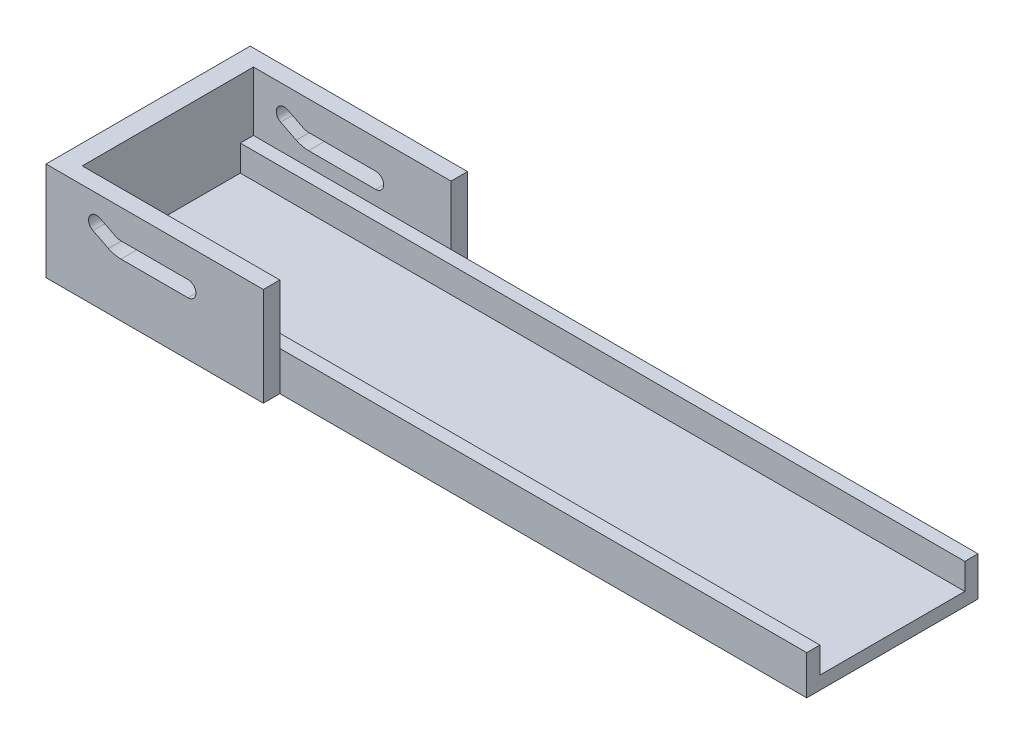
ISO-10303-21;
HEADER;
FILE_DESCRIPTION(('STEP AP214'),'2;1');
FILE_NAME('part.step','',(''),(''),'','','');
FILE_SCHEMA(('AUTOMOTIVE_DESIGN { 1 0 10303 214 1 1 1 1 }'));
ENDSEC;
DATA;
#1=APPLICATION_CONTEXT('core data for automotive mechanical design processes');
#2=APPLICATION_PROTOCOL_DEFINITION('international standard','automotive_design',2000,#1);
#3=PRODUCT_CONTEXT('',#1,'mechanical');
#4=PRODUCT('Part','Part','',(#3));
#5=PRODUCT_RELATED_PRODUCT_CATEGORY('part','',(#4));
#6=PRODUCT_DEFINITION_FORMATION('','',#4);
#7=PRODUCT_DEFINITION_CONTEXT('part definition',#1,'design');
#8=PRODUCT_DEFINITION('design','',#6,#7);
#9=PRODUCT_DEFINITION_SHAPE('','',#8);
#10=(LENGTH_UNIT() NAMED_UNIT(*) SI_UNIT(.MILLI.,.METRE.));
#11=(NAMED_UNIT(*) PLANE_ANGLE_UNIT() SI_UNIT($,.RADIAN.));
#12=(NAMED_UNIT(*) SI_UNIT($,.STERADIAN.) SOLID_ANGLE_UNIT());
#13=UNCERTAINTY_MEASURE_WITH_UNIT(LENGTH_MEASURE(1.E-05),#10,'distance_accuracy_value','');
#14=(GEOMETRIC_REPRESENTATION_CONTEXT(3) GLOBAL_UNCERTAINTY_ASSIGNED_CONTEXT((#13)) GLOBAL_UNIT_ASSIGNED_CONTEXT((#10,
#11,#12)) REPRESENTATION_CONTEXT('',''));
#15=CARTESIAN_POINT('',(0.,0.,0.));
#16=DIRECTION('',(0.,0.,1.));
#17=DIRECTION('',(1.,0.,0.));
#18=AXIS2_PLACEMENT_3D('',#15,#16,#17);
#19=CARTESIAN_POINT('',(110.,0.,0.));
#20=DIRECTION('',(-1.,0.,0.));
#21=DIRECTION('',(0.,0.,1.));
#22=AXIS2_PLACEMENT_3D('',#19,#20,#21);
#23=PLANE('',#22);
#24=DIRECTION('',(0.,1.,0.));
#25=VECTOR('',#24,1.);
#26=CARTESIAN_POINT('',(110.,5.95,-13.));
#27=LINE('',#26,#25);
#28=CARTESIAN_POINT('',(110.,-5.95,-13.));
#29=VERTEX_POINT('',#28);
#30=CARTESIAN_POINT('',(110.,0.,-13.));
#31=VERTEX_POINT('',#30);
#32=EDGE_CURVE('E550',#29,#31,#27,.T.);
#33=ORIENTED_EDGE('',*,*,#32,.T.);
#34=DIRECTION('',(0.,0.,1.));
#35=VECTOR('',#34,1.);
#36=CARTESIAN_POINT('',(110.,0.,0.));
#37=LINE('',#36,#35);
#38=CARTESIAN_POINT('',(110.,0.,-11.));
#39=VERTEX_POINT('',#38);
#40=EDGE_CURVE('E507',#31,#39,#37,.T.);
#41=ORIENTED_EDGE('',*,*,#40,.T.);
#42=DIRECTION('',(0.,1.,0.));
#43=VECTOR('',#42,1.);
#44=CARTESIAN_POINT('',(110.,3.95,-11.));
#45=LINE('',#44,#43);
#46=CARTESIAN_POINT('',(110.,-3.95,-11.));
#47=VERTEX_POINT('',#46);
#48=EDGE_CURVE('E516',#47,#39,#45,.T.);
#49=ORIENTED_EDGE('',*,*,#48,.F.);
#50=DIRECTION('',(0.,0.,-1.));
#51=VECTOR('',#50,1.);
#52=CARTESIAN_POINT('',(110.,-3.95,11.));
#53=LINE('',#52,#51);
#54=CARTESIAN_POINT('',(110.,-3.95,11.));
#55=VERTEX_POINT('',#54);
#56=EDGE_CURVE('E524',#55,#47,#53,.T.);
#57=ORIENTED_EDGE('',*,*,#56,.F.);
#58=DIRECTION('',(0.,-1.,0.));
#59=VECTOR('',#58,1.);
#60=CARTESIAN_POINT('',(110.,3.95,11.));
#61=LINE('',#60,#59);
#62=CARTESIAN_POINT('',(110.,0.,11.));
#63=VERTEX_POINT('',#62);
#64=EDGE_CURVE('E520',#63,#55,#61,.T.);
#65=ORIENTED_EDGE('',*,*,#64,.F.);
#66=CARTESIAN_POINT('',(110.,0.,13.));
#67=VERTEX_POINT('',#66);
#68=EDGE_CURVE('E501',#63,#67,#37,.T.);
#69=ORIENTED_EDGE('',*,*,#68,.T.);
#70=DIRECTION('',(0.,-1.,0.));
#71=VECTOR('',#70,1.);
#72=CARTESIAN_POINT('',(110.,5.95,13.));
#73=LINE('',#72,#71);
#74=CARTESIAN_POINT('',(110.,-5.95,13.));
#75=VERTEX_POINT('',#74);
#76=EDGE_CURVE('E544',#67,#75,#73,.T.);
#77=ORIENTED_EDGE('',*,*,#76,.T.);
#78=DIRECTION('',(0.,0.,-1.));
#79=VECTOR('',#78,1.);
#80=CARTESIAN_POINT('',(110.,-5.95,13.));
#81=LINE('',#80,#79);
#82=EDGE_CURVE('E547',#75,#29,#81,.T.);
#83=ORIENTED_EDGE('',*,*,#82,.T.);
#84=EDGE_LOOP('',(#33,#41,#49,#57,#65,#69,#77,#83));
#85=FACE_BOUND('',#84,.T.);
#86=ADVANCED_FACE('F45',(#85),#23,.F.);
#87=CARTESIAN_POINT('',(110.,5.95,13.));
#88=DIRECTION('',(0.,0.,-1.));
#89=DIRECTION('',(0.,1.,0.));
#90=AXIS2_PLACEMENT_3D('',#87,#88,#89);
#91=PLANE('',#90);
#92=DIRECTION('',(1.,0.,0.));
#93=VECTOR('',#92,1.);
#94=CARTESIAN_POINT('',(-3.21348539826178,0.,13.));
#95=LINE('',#94,#93);
#96=CARTESIAN_POINT('',(30.,0.,13.));
#97=VERTEX_POINT('',#96);
#98=EDGE_CURVE('E487',#97,#67,#95,.T.);
#99=ORIENTED_EDGE('',*,*,#98,.F.);
#100=DIRECTION('',(0.,-1.,0.));
#101=VECTOR('',#100,1.);
#102=CARTESIAN_POINT('',(30.,-5.95,13.));
#103=LINE('',#102,#101);
#104=CARTESIAN_POINT('',(30.,-5.95,13.));
#105=VERTEX_POINT('',#104);
#106=EDGE_CURVE('E11',#97,#105,#103,.T.);
#107=ORIENTED_EDGE('',*,*,#106,.T.);
#108=DIRECTION('',(-1.,0.,0.));
#109=VECTOR('',#108,1.);
#110=CARTESIAN_POINT('',(110.,-5.95,13.));
#111=LINE('',#110,#109);
#112=EDGE_CURVE('E557',#75,#105,#111,.T.);
#113=ORIENTED_EDGE('',*,*,#112,.F.);
#114=ORIENTED_EDGE('',*,*,#76,.F.);
#115=EDGE_LOOP('',(#99,#107,#113,#114));
#116=FACE_BOUND('',#115,.T.);
#117=ADVANCED_FACE('F47',(#116),#91,.F.);
#118=CARTESIAN_POINT('',(110.,-5.95,13.));
#119=DIRECTION('',(0.,1.,0.));
#120=DIRECTION('',(0.,0.,1.));
#121=AXIS2_PLACEMENT_3D('',#118,#119,#120);
#122=PLANE('',#121);
#123=DIRECTION('',(-1.,0.,0.));
#124=VECTOR('',#123,1.);
#125=CARTESIAN_POINT('',(30.,-5.95,15.5));
#126=LINE('',#125,#124);
#127=CARTESIAN_POINT('',(30.,-5.95,15.5));
#128=VERTEX_POINT('',#127);
#129=CARTESIAN_POINT('',(-3.,-5.95,15.5));
#130=VERTEX_POINT('',#129);
#131=EDGE_CURVE('E436',#128,#130,#126,.T.);
#132=ORIENTED_EDGE('',*,*,#131,.T.);
#133=DIRECTION('',(0.,0.,1.));
#134=VECTOR('',#133,1.);
#135=CARTESIAN_POINT('',(-3.,-5.95,-15.5));
#136=LINE('',#135,#134);
#137=CARTESIAN_POINT('',(-3.,-5.95,-15.5));
#138=VERTEX_POINT('',#137);
#139=EDGE_CURVE('E420',#138,#130,#136,.T.);
#140=ORIENTED_EDGE('',*,*,#139,.F.);
#141=DIRECTION('',(-1.,0.,0.));
#142=VECTOR('',#141,1.);
#143=CARTESIAN_POINT('',(30.,-5.95,-15.5));
#144=LINE('',#143,#142);
#145=CARTESIAN_POINT('',(30.,-5.95,-15.5));
#146=VERTEX_POINT('',#145);
#147=EDGE_CURVE('E484',#146,#138,#144,.T.);
#148=ORIENTED_EDGE('',*,*,#147,.F.);
#149=DIRECTION('',(0.,0.,1.));
#150=VECTOR('',#149,1.);
#151=CARTESIAN_POINT('',(30.,-5.95,-13.));
#152=LINE('',#151,#150);
#153=CARTESIAN_POINT('',(30.,-5.95,-13.));
#154=VERTEX_POINT('',#153);
#155=EDGE_CURVE('E476',#146,#154,#152,.T.);
#156=ORIENTED_EDGE('',*,*,#155,.T.);
#157=DIRECTION('',(-1.,0.,0.));
#158=VECTOR('',#157,1.);
#159=CARTESIAN_POINT('',(110.,-5.95,-13.));
#160=LINE('',#159,#158);
#161=EDGE_CURVE('E554',#29,#154,#160,.T.);
#162=ORIENTED_EDGE('',*,*,#161,.F.);
#163=ORIENTED_EDGE('',*,*,#82,.F.);
#164=ORIENTED_EDGE('',*,*,#112,.T.);
#165=DIRECTION('',(0.,0.,1.));
#166=VECTOR('',#165,1.);
#167=CARTESIAN_POINT('',(30.,-5.95,13.));
#168=LINE('',#167,#166);
#169=EDGE_CURVE('E457',#105,#128,#168,.T.);
#170=ORIENTED_EDGE('',*,*,#169,.T.);
#171=EDGE_LOOP('',(#132,#140,#148,#156,#162,#163,#164,#170));
#172=FACE_BOUND('',#171,.T.);
#173=ADVANCED_FACE('F589',(#172),#122,.F.);
#174=CARTESIAN_POINT('',(110.,5.95,-13.));
#175=DIRECTION('',(0.,0.,1.));
#176=DIRECTION('',(0.,-1.,0.));
#177=AXIS2_PLACEMENT_3D('',#174,#175,#176);
#178=PLANE('',#177);
#179=ORIENTED_EDGE('',*,*,#161,.T.);
#180=DIRECTION('',(0.,1.,0.));
#181=VECTOR('',#180,1.);
#182=CARTESIAN_POINT('',(30.,-5.95,-13.));
#183=LINE('',#182,#181);
#184=CARTESIAN_POINT('',(30.,0.,-13.));
#185=VERTEX_POINT('',#184);
#186=EDGE_CURVE('E463',#154,#185,#183,.T.);
#187=ORIENTED_EDGE('',*,*,#186,.T.);
#188=DIRECTION('',(1.,0.,0.));
#189=VECTOR('',#188,1.);
#190=CARTESIAN_POINT('',(110.,0.,-13.));
#191=LINE('',#190,#189);
#192=EDGE_CURVE('E515',#185,#31,#191,.T.);
#193=ORIENTED_EDGE('',*,*,#192,.T.);
#194=ORIENTED_EDGE('',*,*,#32,.F.);
#195=EDGE_LOOP('',(#179,#187,#193,#194));
#196=FACE_BOUND('',#195,.T.);
#197=ADVANCED_FACE('F595',(#196),#178,.F.);
#198=CARTESIAN_POINT('',(110.,3.95,-11.));
#199=DIRECTION('',(0.,0.,1.));
#200=DIRECTION('',(0.,-1.,0.));
#201=AXIS2_PLACEMENT_3D('',#198,#199,#200);
#202=PLANE('',#201);
#203=DIRECTION('',(1.,0.,0.));
#204=VECTOR('',#203,1.);
#205=CARTESIAN_POINT('',(110.,0.,-11.));
#206=LINE('',#205,#204);
#207=CARTESIAN_POINT('',(0.,0.,-11.));
#208=VERTEX_POINT('',#207);
#209=EDGE_CURVE('E506',#208,#39,#206,.T.);
#210=ORIENTED_EDGE('',*,*,#209,.F.);
#211=DIRECTION('',(0.,1.,0.));
#212=VECTOR('',#211,1.);
#213=CARTESIAN_POINT('',(0.,3.95,-11.));
#214=LINE('',#213,#212);
#215=CARTESIAN_POINT('',(0.,-3.95,-11.));
#216=VERTEX_POINT('',#215);
#217=EDGE_CURVE('E514',#216,#208,#214,.T.);
#218=ORIENTED_EDGE('',*,*,#217,.F.);
#219=DIRECTION('',(-1.,0.,0.));
#220=VECTOR('',#219,1.);
#221=CARTESIAN_POINT('',(110.,-3.95,-11.));
#222=LINE('',#221,#220);
#223=EDGE_CURVE('E527',#47,#216,#222,.T.);
#224=ORIENTED_EDGE('',*,*,#223,.F.);
#225=ORIENTED_EDGE('',*,*,#48,.T.);
#226=EDGE_LOOP('',(#210,#218,#224,#225));
#227=FACE_BOUND('',#226,.T.);
#228=ADVANCED_FACE('F606',(#227),#202,.T.);
#229=CARTESIAN_POINT('',(110.,3.95,11.));
#230=DIRECTION('',(0.,0.,-1.));
#231=DIRECTION('',(0.,1.,0.));
#232=AXIS2_PLACEMENT_3D('',#229,#230,#231);
#233=PLANE('',#232);
#234=DIRECTION('',(-1.,0.,0.));
#235=VECTOR('',#234,1.);
#236=CARTESIAN_POINT('',(110.,0.,11.));
#237=LINE('',#236,#235);
#238=CARTESIAN_POINT('',(0.,0.,11.));
#239=VERTEX_POINT('',#238);
#240=EDGE_CURVE('E49',#63,#239,#237,.T.);
#241=ORIENTED_EDGE('',*,*,#240,.F.);
#242=ORIENTED_EDGE('',*,*,#64,.T.);
#243=DIRECTION('',(-1.,0.,0.));
#244=VECTOR('',#243,1.);
#245=CARTESIAN_POINT('',(110.,-3.95,11.));
#246=LINE('',#245,#244);
#247=CARTESIAN_POINT('',(0.,-3.95,11.));
#248=VERTEX_POINT('',#247);
#249=EDGE_CURVE('E541',#55,#248,#246,.T.);
#250=ORIENTED_EDGE('',*,*,#249,.T.);
#251=DIRECTION('',(0.,-1.,0.));
#252=VECTOR('',#251,1.);
#253=CARTESIAN_POINT('',(0.,3.95,11.));
#254=LINE('',#253,#252);
#255=EDGE_CURVE('E531',#239,#248,#254,.T.);
#256=ORIENTED_EDGE('',*,*,#255,.F.);
#257=EDGE_LOOP('',(#241,#242,#250,#256));
#258=FACE_BOUND('',#257,.T.);
#259=ADVANCED_FACE('F571',(#258),#233,.T.);
#260=CARTESIAN_POINT('',(110.,-3.95,11.));
#261=DIRECTION('',(0.,1.,0.));
#262=DIRECTION('',(0.,0.,1.));
#263=AXIS2_PLACEMENT_3D('',#260,#261,#262);
#264=PLANE('',#263);
#265=DIRECTION('',(0.,0.,-1.));
#266=VECTOR('',#265,1.);
#267=CARTESIAN_POINT('',(0.,-3.95,11.));
#268=LINE('',#267,#266);
#269=EDGE_CURVE('E521',#248,#216,#268,.T.);
#270=ORIENTED_EDGE('',*,*,#269,.F.);
#271=ORIENTED_EDGE('',*,*,#249,.F.);
#272=ORIENTED_EDGE('',*,*,#56,.T.);
#273=ORIENTED_EDGE('',*,*,#223,.T.);
#274=EDGE_LOOP('',(#270,#271,#272,#273));
#275=FACE_BOUND('',#274,.T.);
#276=ADVANCED_FACE('F608',(#275),#264,.T.);
#277=CARTESIAN_POINT('',(-3.21348539826178,0.,-37.));
#278=DIRECTION('',(0.,-1.,0.));
#279=DIRECTION('',(0.,0.,-1.));
#280=AXIS2_PLACEMENT_3D('',#277,#278,#279);
#281=PLANE('',#280);
#282=ORIENTED_EDGE('',*,*,#240,.T.);
#283=DIRECTION('',(0.,0.,1.));
#284=VECTOR('',#283,1.);
#285=CARTESIAN_POINT('',(0.,0.,0.));
#286=LINE('',#285,#284);
#287=CARTESIAN_POINT('',(0.,0.,13.));
#288=VERTEX_POINT('',#287);
#289=EDGE_CURVE('E497',#239,#288,#286,.T.);
#290=ORIENTED_EDGE('',*,*,#289,.T.);
#291=EDGE_CURVE('E493',#288,#97,#95,.T.);
#292=ORIENTED_EDGE('',*,*,#291,.T.);
#293=ORIENTED_EDGE('',*,*,#98,.T.);
#294=ORIENTED_EDGE('',*,*,#68,.F.);
#295=EDGE_LOOP('',(#282,#290,#292,#293,#294));
#296=FACE_BOUND('',#295,.T.);
#297=ADVANCED_FACE('F567',(#296),#281,.F.);
#298=CARTESIAN_POINT('',(0.,0.,-13.));
#299=VERTEX_POINT('',#298);
#300=EDGE_CURVE('E502',#299,#208,#286,.T.);
#301=ORIENTED_EDGE('',*,*,#300,.T.);
#302=ORIENTED_EDGE('',*,*,#209,.T.);
#303=ORIENTED_EDGE('',*,*,#40,.F.);
#304=ORIENTED_EDGE('',*,*,#192,.F.);
#305=EDGE_CURVE('E510',#299,#185,#191,.T.);
#306=ORIENTED_EDGE('',*,*,#305,.F.);
#307=EDGE_LOOP('',(#301,#302,#303,#304,#306));
#308=FACE_BOUND('',#307,.T.);
#309=ADVANCED_FACE('F601',(#308),#281,.F.);
#310=CARTESIAN_POINT('',(30.,-5.95,-13.));
#311=DIRECTION('',(0.,0.,1.));
#312=DIRECTION('',(1.,0.,0.));
#313=AXIS2_PLACEMENT_3D('',#310,#311,#312);
#314=PLANE('',#313);
#315=CARTESIAN_POINT('',(8.37948162930157,6.41681227616429,-13.));
#316=DIRECTION('',(0.,0.,1.));
#317=DIRECTION('',(1.,0.,0.));
#318=AXIS2_PLACEMENT_3D('',#315,#316,#317);
#319=CIRCLE('',#318,4.22953266978898);
#320=CARTESIAN_POINT('',(8.37948162930157,2.18727960637531,-13.));
#321=VERTEX_POINT('',#320);
#322=CARTESIAN_POINT('',(6.4879771167607,2.63380325108256,-13.));
#323=VERTEX_POINT('',#322);
#324=EDGE_CURVE('E400',#321,#323,#319,.F.);
#325=ORIENTED_EDGE('',*,*,#324,.T.);
#326=DIRECTION('',(-0.894427190999916,0.447213595499958,0.));
#327=VECTOR('',#326,1.);
#328=CARTESIAN_POINT('',(28.7311167237852,-8.48776655242968,-13.));
#329=LINE('',#328,#327);
#330=CARTESIAN_POINT('',(4.127649664575,3.81396697717541,-13.));
#331=VERTEX_POINT('',#330);
#332=EDGE_CURVE('E411',#323,#331,#329,.T.);
#333=ORIENTED_EDGE('',*,*,#332,.T.);
#334=CARTESIAN_POINT('',(4.66430597917495,4.88727960637531,-13.));
#335=DIRECTION('',(0.,0.,1.));
#336=DIRECTION('',(1.,0.,0.));
#337=AXIS2_PLACEMENT_3D('',#334,#335,#336);
#338=CIRCLE('',#337,1.2);
#339=CARTESIAN_POINT('',(5.20096229377489,5.96059223557521,-13.));
#340=VERTEX_POINT('',#339);
#341=EDGE_CURVE('E339',#331,#340,#338,.F.);
#342=ORIENTED_EDGE('',*,*,#341,.T.);
#343=DIRECTION('',(-0.894427190999916,0.447213595499958,0.));
#344=VECTOR('',#343,1.);
#345=CARTESIAN_POINT('',(29.8044293529851,-6.34114129402987,-13.));
#346=LINE('',#345,#344);
#347=CARTESIAN_POINT('',(7.5612897459606,4.78042850948235,-13.));
#348=VERTEX_POINT('',#347);
#349=EDGE_CURVE('E349',#348,#340,#346,.T.);
#350=ORIENTED_EDGE('',*,*,#349,.F.);
#351=CARTESIAN_POINT('',(8.37948162930157,6.41681227616429,-13.));
#352=DIRECTION('',(0.,0.,1.));
#353=DIRECTION('',(1.,0.,0.));
#354=AXIS2_PLACEMENT_3D('',#351,#352,#353);
#355=CIRCLE('',#354,1.82953266978898);
#356=CARTESIAN_POINT('',(8.37948162930157,4.58727960637531,-13.));
#357=VERTEX_POINT('',#356);
#358=EDGE_CURVE('E358',#357,#348,#355,.F.);
#359=ORIENTED_EDGE('',*,*,#358,.F.);
#360=DIRECTION('',(-1.,0.,0.));
#361=VECTOR('',#360,1.);
#362=CARTESIAN_POINT('',(30.,4.58727960637531,-13.));
#363=LINE('',#362,#361);
#364=CARTESIAN_POINT('',(18.5631662454529,4.58727960637531,-13.));
#365=VERTEX_POINT('',#364);
#366=EDGE_CURVE('E367',#365,#357,#363,.T.);
#367=ORIENTED_EDGE('',*,*,#366,.F.);
#368=CARTESIAN_POINT('',(18.5631662454529,3.38727960637531,-13.));
#369=DIRECTION('',(0.,0.,1.));
#370=DIRECTION('',(1.,0.,0.));
#371=AXIS2_PLACEMENT_3D('',#368,#369,#370);
#372=CIRCLE('',#371,1.2);
#373=CARTESIAN_POINT('',(18.5631662454529,2.18727960637531,-13.));
#374=VERTEX_POINT('',#373);
#375=EDGE_CURVE('E378',#365,#374,#372,.F.);
#376=ORIENTED_EDGE('',*,*,#375,.T.);
#377=DIRECTION('',(-1.,0.,0.));
#378=VECTOR('',#377,1.);
#379=CARTESIAN_POINT('',(30.,2.18727960637531,-13.));
#380=LINE('',#379,#378);
#381=EDGE_CURVE('E390',#374,#321,#380,.T.);
#382=ORIENTED_EDGE('',*,*,#381,.T.);
#383=EDGE_LOOP('',(#325,#333,#342,#350,#359,#367,#376,#382));
#384=FACE_BOUND('',#383,.T.);
#385=DIRECTION('',(0.,1.,0.));
#386=VECTOR('',#385,1.);
#387=CARTESIAN_POINT('',(0.,-5.95,-13.));
#388=LINE('',#387,#386);
#389=CARTESIAN_POINT('',(0.,9.00042786494572,-13.));
#390=VERTEX_POINT('',#389);
#391=EDGE_CURVE('E449',#299,#390,#388,.T.);
#392=ORIENTED_EDGE('',*,*,#391,.F.);
#393=ORIENTED_EDGE('',*,*,#305,.T.);
#394=CARTESIAN_POINT('',(30.,9.00042786494572,-13.));
#395=VERTEX_POINT('',#394);
#396=EDGE_CURVE('E468',#185,#395,#183,.T.);
#397=ORIENTED_EDGE('',*,*,#396,.T.);
#398=DIRECTION('',(-1.,0.,0.));
#399=VECTOR('',#398,1.);
#400=CARTESIAN_POINT('',(30.,9.00042786494572,-13.));
#401=LINE('',#400,#399);
#402=EDGE_CURVE('E480',#395,#390,#401,.T.);
#403=ORIENTED_EDGE('',*,*,#402,.T.);
#404=EDGE_LOOP('',(#392,#393,#397,#403));
#405=FACE_BOUND('',#404,.T.);
#406=ADVANCED_FACE('F667',(#384,#405),#314,.T.);
#407=CARTESIAN_POINT('',(30.,-5.95,-15.5));
#408=DIRECTION('',(0.,0.,-1.));
#409=DIRECTION('',(-1.,0.,0.));
#410=AXIS2_PLACEMENT_3D('',#407,#408,#409);
#411=PLANE('',#410);
#412=CARTESIAN_POINT('',(4.66430597917495,4.88727960637531,-15.5));
#413=DIRECTION('',(0.,0.,-1.));
#414=DIRECTION('',(-1.,0.,0.));
#415=AXIS2_PLACEMENT_3D('',#412,#413,#414);
#416=CIRCLE('',#415,1.2);
#417=CARTESIAN_POINT('',(5.20096229377489,5.96059223557521,-15.5));
#418=VERTEX_POINT('',#417);
#419=CARTESIAN_POINT('',(4.127649664575,3.81396697717541,-15.5));
#420=VERTEX_POINT('',#419);
#421=EDGE_CURVE('E335',#418,#420,#416,.F.);
#422=ORIENTED_EDGE('',*,*,#421,.T.);
#423=DIRECTION('',(0.894427190999916,-0.447213595499958,0.));
#424=VECTOR('',#423,1.);
#425=CARTESIAN_POINT('',(28.7311167237852,-8.48776655242968,-15.5));
#426=LINE('',#425,#424);
#427=CARTESIAN_POINT('',(6.4879771167607,2.63380325108256,-15.5));
#428=VERTEX_POINT('',#427);
#429=EDGE_CURVE('E407',#420,#428,#426,.T.);
#430=ORIENTED_EDGE('',*,*,#429,.T.);
#431=CARTESIAN_POINT('',(8.37948162930157,6.41681227616429,-15.5));
#432=DIRECTION('',(0.,0.,-1.));
#433=DIRECTION('',(-1.,0.,0.));
#434=AXIS2_PLACEMENT_3D('',#431,#432,#433);
#435=CIRCLE('',#434,4.22953266978898);
#436=CARTESIAN_POINT('',(8.37948162930157,2.18727960637531,-15.5));
#437=VERTEX_POINT('',#436);
#438=EDGE_CURVE('E396',#428,#437,#435,.F.);
#439=ORIENTED_EDGE('',*,*,#438,.T.);
#440=DIRECTION('',(1.,0.,0.));
#441=VECTOR('',#440,1.);
#442=CARTESIAN_POINT('',(30.,2.18727960637531,-15.5));
#443=LINE('',#442,#441);
#444=CARTESIAN_POINT('',(18.5631662454529,2.18727960637531,-15.5));
#445=VERTEX_POINT('',#444);
#446=EDGE_CURVE('E386',#437,#445,#443,.T.);
#447=ORIENTED_EDGE('',*,*,#446,.T.);
#448=CARTESIAN_POINT('',(18.5631662454529,3.38727960637531,-15.5));
#449=DIRECTION('',(0.,0.,-1.));
#450=DIRECTION('',(-1.,0.,0.));
#451=AXIS2_PLACEMENT_3D('',#448,#449,#450);
#452=CIRCLE('',#451,1.2);
#453=CARTESIAN_POINT('',(18.5631662454529,4.58727960637531,-15.5));
#454=VERTEX_POINT('',#453);
#455=EDGE_CURVE('E374',#445,#454,#452,.F.);
#456=ORIENTED_EDGE('',*,*,#455,.T.);
#457=DIRECTION('',(1.,0.,0.));
#458=VECTOR('',#457,1.);
#459=CARTESIAN_POINT('',(30.,4.58727960637531,-15.5));
#460=LINE('',#459,#458);
#461=CARTESIAN_POINT('',(8.37948162930157,4.58727960637531,-15.5));
#462=VERTEX_POINT('',#461);
#463=EDGE_CURVE('E364',#462,#454,#460,.T.);
#464=ORIENTED_EDGE('',*,*,#463,.F.);
#465=CARTESIAN_POINT('',(8.37948162930157,6.41681227616429,-15.5));
#466=DIRECTION('',(0.,0.,-1.));
#467=DIRECTION('',(-1.,0.,0.));
#468=AXIS2_PLACEMENT_3D('',#465,#466,#467);
#469=CIRCLE('',#468,1.82953266978898);
#470=CARTESIAN_POINT('',(7.5612897459606,4.78042850948235,-15.5));
#471=VERTEX_POINT('',#470);
#472=EDGE_CURVE('E355',#471,#462,#469,.F.);
#473=ORIENTED_EDGE('',*,*,#472,.F.);
#474=DIRECTION('',(0.894427190999916,-0.447213595499958,0.));
#475=VECTOR('',#474,1.);
#476=CARTESIAN_POINT('',(29.8044293529851,-6.34114129402987,-15.5));
#477=LINE('',#476,#475);
#478=EDGE_CURVE('E346',#418,#471,#477,.T.);
#479=ORIENTED_EDGE('',*,*,#478,.F.);
#480=EDGE_LOOP('',(#422,#430,#439,#447,#456,#464,#473,#479));
#481=FACE_BOUND('',#480,.T.);
#482=ORIENTED_EDGE('',*,*,#147,.T.);
#483=DIRECTION('',(0.,-1.,0.));
#484=VECTOR('',#483,1.);
#485=CARTESIAN_POINT('',(-3.,9.00042786494572,-15.5));
#486=LINE('',#485,#484);
#487=CARTESIAN_POINT('',(-3.,9.00042786494572,-15.5));
#488=VERTEX_POINT('',#487);
#489=EDGE_CURVE('E416',#488,#138,#486,.T.);
#490=ORIENTED_EDGE('',*,*,#489,.F.);
#491=DIRECTION('',(-1.,0.,0.));
#492=VECTOR('',#491,1.);
#493=CARTESIAN_POINT('',(30.,9.00042786494572,-15.5));
#494=LINE('',#493,#492);
#495=CARTESIAN_POINT('',(30.,9.00042786494572,-15.5));
#496=VERTEX_POINT('',#495);
#497=EDGE_CURVE('E488',#496,#488,#494,.T.);
#498=ORIENTED_EDGE('',*,*,#497,.F.);
#499=DIRECTION('',(0.,-1.,0.));
#500=VECTOR('',#499,1.);
#501=CARTESIAN_POINT('',(30.,-5.95,-15.5));
#502=LINE('',#501,#500);
#503=EDGE_CURVE('E472',#496,#146,#502,.T.);
#504=ORIENTED_EDGE('',*,*,#503,.T.);
#505=EDGE_LOOP('',(#482,#490,#498,#504));
#506=FACE_BOUND('',#505,.T.);
#507=ADVANCED_FACE('F686',(#481,#506),#411,.T.);
#508=CARTESIAN_POINT('',(30.,9.00042786494572,-13.));
#509=DIRECTION('',(0.,1.,0.));
#510=DIRECTION('',(0.,0.,1.));
#511=AXIS2_PLACEMENT_3D('',#508,#509,#510);
#512=PLANE('',#511);
#513=ORIENTED_EDGE('',*,*,#497,.T.);
#514=DIRECTION('',(0.,0.,-1.));
#515=VECTOR('',#514,1.);
#516=CARTESIAN_POINT('',(-3.,9.00042786494572,-15.5));
#517=LINE('',#516,#515);
#518=CARTESIAN_POINT('',(-3.,9.00042786494572,15.5));
#519=VERTEX_POINT('',#518);
#520=EDGE_CURVE('E428',#519,#488,#517,.T.);
#521=ORIENTED_EDGE('',*,*,#520,.F.);
#522=DIRECTION('',(-1.,0.,0.));
#523=VECTOR('',#522,1.);
#524=CARTESIAN_POINT('',(30.,9.00042786494572,15.5));
#525=LINE('',#524,#523);
#526=CARTESIAN_POINT('',(30.,9.00042786494572,15.5));
#527=VERTEX_POINT('',#526);
#528=EDGE_CURVE('E440',#527,#519,#525,.T.);
#529=ORIENTED_EDGE('',*,*,#528,.F.);
#530=DIRECTION('',(0.,0.,-1.));
#531=VECTOR('',#530,1.);
#532=CARTESIAN_POINT('',(30.,9.00042786494572,13.));
#533=LINE('',#532,#531);
#534=CARTESIAN_POINT('',(30.,9.00042786494572,13.));
#535=VERTEX_POINT('',#534);
#536=EDGE_CURVE('E439',#527,#535,#533,.T.);
#537=ORIENTED_EDGE('',*,*,#536,.T.);
#538=DIRECTION('',(-1.,0.,0.));
#539=VECTOR('',#538,1.);
#540=CARTESIAN_POINT('',(30.,9.00042786494572,13.));
#541=LINE('',#540,#539);
#542=CARTESIAN_POINT('',(0.,9.00042786494572,13.));
#543=VERTEX_POINT('',#542);
#544=EDGE_CURVE('E432',#535,#543,#541,.T.);
#545=ORIENTED_EDGE('',*,*,#544,.T.);
#546=DIRECTION('',(0.,0.,-1.));
#547=VECTOR('',#546,1.);
#548=CARTESIAN_POINT('',(0.,9.00042786494572,-15.5));
#549=LINE('',#548,#547);
#550=EDGE_CURVE('E415',#543,#390,#549,.T.);
#551=ORIENTED_EDGE('',*,*,#550,.T.);
#552=ORIENTED_EDGE('',*,*,#402,.F.);
#553=DIRECTION('',(0.,0.,-1.));
#554=VECTOR('',#553,1.);
#555=CARTESIAN_POINT('',(30.,9.00042786494572,-13.));
#556=LINE('',#555,#554);
#557=EDGE_CURVE('E467',#395,#496,#556,.T.);
#558=ORIENTED_EDGE('',*,*,#557,.T.);
#559=EDGE_LOOP('',(#513,#521,#529,#537,#545,#551,#552,#558));
#560=FACE_BOUND('',#559,.T.);
#561=ADVANCED_FACE('F697',(#560),#512,.T.);
#562=CARTESIAN_POINT('',(30.,0.,0.));
#563=DIRECTION('',(-1.,0.,0.));
#564=DIRECTION('',(0.,0.,1.));
#565=AXIS2_PLACEMENT_3D('',#562,#563,#564);
#566=PLANE('',#565);
#567=ORIENTED_EDGE('',*,*,#186,.F.);
#568=ORIENTED_EDGE('',*,*,#155,.F.);
#569=ORIENTED_EDGE('',*,*,#503,.F.);
#570=ORIENTED_EDGE('',*,*,#557,.F.);
#571=ORIENTED_EDGE('',*,*,#396,.F.);
#572=EDGE_LOOP('',(#567,#568,#569,#570,#571));
#573=FACE_BOUND('',#572,.T.);
#574=ADVANCED_FACE('F708',(#573),#566,.F.);
#575=CARTESIAN_POINT('',(30.,-5.95,13.));
#576=DIRECTION('',(0.,0.,-1.));
#577=DIRECTION('',(-1.,0.,0.));
#578=AXIS2_PLACEMENT_3D('',#575,#576,#577);
#579=PLANE('',#578);
#580=CARTESIAN_POINT('',(4.66430597917495,4.88727960637531,13.));
#581=DIRECTION('',(0.,0.,-1.));
#582=DIRECTION('',(-1.,0.,0.));
#583=AXIS2_PLACEMENT_3D('',#580,#581,#582);
#584=CIRCLE('',#583,1.2);
#585=CARTESIAN_POINT('',(5.20096229377489,5.96059223557521,13.));
#586=VERTEX_POINT('',#585);
#587=CARTESIAN_POINT('',(4.127649664575,3.81396697717541,13.));
#588=VERTEX_POINT('',#587);
#589=EDGE_CURVE('E271',#586,#588,#584,.F.);
#590=ORIENTED_EDGE('',*,*,#589,.T.);
#591=DIRECTION('',(0.894427190999916,-0.447213595499958,0.));
#592=VECTOR('',#591,1.);
#593=CARTESIAN_POINT('',(28.7311167237852,-8.48776655242968,13.));
#594=LINE('',#593,#592);
#595=CARTESIAN_POINT('',(6.4879771167607,2.63380325108256,13.));
#596=VERTEX_POINT('',#595);
#597=EDGE_CURVE('E404',#588,#596,#594,.T.);
#598=ORIENTED_EDGE('',*,*,#597,.T.);
#599=CARTESIAN_POINT('',(8.37948162930157,6.41681227616429,13.));
#600=DIRECTION('',(0.,0.,-1.));
#601=DIRECTION('',(-1.,0.,0.));
#602=AXIS2_PLACEMENT_3D('',#599,#600,#601);
#603=CIRCLE('',#602,4.22953266978898);
#604=CARTESIAN_POINT('',(8.37948162930157,2.18727960637531,13.));
#605=VERTEX_POINT('',#604);
#606=EDGE_CURVE('E269',#596,#605,#603,.F.);
#607=ORIENTED_EDGE('',*,*,#606,.T.);
#608=DIRECTION('',(1.,0.,0.));
#609=VECTOR('',#608,1.);
#610=CARTESIAN_POINT('',(30.,2.18727960637531,13.));
#611=LINE('',#610,#609);
#612=CARTESIAN_POINT('',(18.5631662454529,2.18727960637531,13.));
#613=VERTEX_POINT('',#612);
#614=EDGE_CURVE('E382',#605,#613,#611,.T.);
#615=ORIENTED_EDGE('',*,*,#614,.T.);
#616=CARTESIAN_POINT('',(18.5631662454529,3.38727960637531,13.));
#617=DIRECTION('',(0.,0.,-1.));
#618=DIRECTION('',(-1.,0.,0.));
#619=AXIS2_PLACEMENT_3D('',#616,#617,#618);
#620=CIRCLE('',#619,1.2);
#621=CARTESIAN_POINT('',(18.5631662454529,4.58727960637531,13.));
#622=VERTEX_POINT('',#621);
#623=EDGE_CURVE('E370',#613,#622,#620,.F.);
#624=ORIENTED_EDGE('',*,*,#623,.T.);
#625=DIRECTION('',(1.,0.,0.));
#626=VECTOR('',#625,1.);
#627=CARTESIAN_POINT('',(30.,4.58727960637531,13.));
#628=LINE('',#627,#626);
#629=CARTESIAN_POINT('',(8.37948162930157,4.58727960637531,13.));
#630=VERTEX_POINT('',#629);
#631=EDGE_CURVE('E361',#630,#622,#628,.T.);
#632=ORIENTED_EDGE('',*,*,#631,.F.);
#633=CARTESIAN_POINT('',(8.37948162930157,6.41681227616429,13.));
#634=DIRECTION('',(0.,0.,-1.));
#635=DIRECTION('',(-1.,0.,0.));
#636=AXIS2_PLACEMENT_3D('',#633,#634,#635);
#637=CIRCLE('',#636,1.82953266978898);
#638=CARTESIAN_POINT('',(7.5612897459606,4.78042850948235,13.));
#639=VERTEX_POINT('',#638);
#640=EDGE_CURVE('E352',#639,#630,#637,.F.);
#641=ORIENTED_EDGE('',*,*,#640,.F.);
#642=DIRECTION('',(0.894427190999916,-0.447213595499958,0.));
#643=VECTOR('',#642,1.);
#644=CARTESIAN_POINT('',(29.8044293529851,-6.34114129402987,13.));
#645=LINE('',#644,#643);
#646=EDGE_CURVE('E343',#586,#639,#645,.T.);
#647=ORIENTED_EDGE('',*,*,#646,.F.);
#648=EDGE_LOOP('',(#590,#598,#607,#615,#624,#632,#641,#647));
#649=FACE_BOUND('',#648,.T.);
#650=ORIENTED_EDGE('',*,*,#291,.F.);
#651=DIRECTION('',(0.,-1.,0.));
#652=VECTOR('',#651,1.);
#653=CARTESIAN_POINT('',(0.,-5.95,13.));
#654=LINE('',#653,#652);
#655=EDGE_CURVE('E445',#543,#288,#654,.T.);
#656=ORIENTED_EDGE('',*,*,#655,.F.);
#657=ORIENTED_EDGE('',*,*,#544,.F.);
#658=EDGE_CURVE('E56',#535,#97,#103,.T.);
#659=ORIENTED_EDGE('',*,*,#658,.T.);
#660=EDGE_LOOP('',(#650,#656,#657,#659));
#661=FACE_BOUND('',#660,.T.);
#662=ADVANCED_FACE('F580',(#649,#661),#579,.T.);
#663=CARTESIAN_POINT('',(30.,-5.95,15.5));
#664=DIRECTION('',(0.,0.,1.));
#665=DIRECTION('',(1.,0.,0.));
#666=AXIS2_PLACEMENT_3D('',#663,#664,#665);
#667=PLANE('',#666);
#668=CARTESIAN_POINT('',(8.37948162930157,6.41681227616429,15.5));
#669=DIRECTION('',(0.,0.,1.));
#670=DIRECTION('',(1.,0.,0.));
#671=AXIS2_PLACEMENT_3D('',#668,#669,#670);
#672=CIRCLE('',#671,4.22953266978898);
#673=CARTESIAN_POINT('',(6.4879771167607,2.63380325108256,15.5));
#674=VERTEX_POINT('',#673);
#675=CARTESIAN_POINT('',(8.37948162930157,2.18727960637531,15.5));
#676=VERTEX_POINT('',#675);
#677=EDGE_CURVE('E262',#674,#676,#672,.T.);
#678=ORIENTED_EDGE('',*,*,#677,.F.);
#679=DIRECTION('',(0.894427190999916,-0.447213595499958,0.));
#680=VECTOR('',#679,1.);
#681=CARTESIAN_POINT('',(2.35111672378517,4.70223344757033,15.5));
#682=LINE('',#681,#680);
#683=CARTESIAN_POINT('',(4.127649664575,3.81396697717541,15.5));
#684=VERTEX_POINT('',#683);
#685=EDGE_CURVE('E251',#684,#674,#682,.T.);
#686=ORIENTED_EDGE('',*,*,#685,.F.);
#687=CARTESIAN_POINT('',(4.66430597917495,4.88727960637531,15.5));
#688=DIRECTION('',(0.,0.,1.));
#689=DIRECTION('',(1.,0.,0.));
#690=AXIS2_PLACEMENT_3D('',#687,#688,#689);
#691=CIRCLE('',#690,1.2);
#692=CARTESIAN_POINT('',(5.20096229377489,5.96059223557521,15.5));
#693=VERTEX_POINT('',#692);
#694=EDGE_CURVE('E299',#693,#684,#691,.T.);
#695=ORIENTED_EDGE('',*,*,#694,.F.);
#696=DIRECTION('',(0.894427190999916,-0.447213595499958,0.));
#697=VECTOR('',#696,1.);
#698=CARTESIAN_POINT('',(3.42442935298506,6.84885870597012,15.5));
#699=LINE('',#698,#697);
#700=CARTESIAN_POINT('',(7.5612897459606,4.78042850948235,15.5));
#701=VERTEX_POINT('',#700);
#702=EDGE_CURVE('E295',#693,#701,#699,.T.);
#703=ORIENTED_EDGE('',*,*,#702,.T.);
#704=CARTESIAN_POINT('',(8.37948162930157,6.41681227616429,15.5));
#705=DIRECTION('',(0.,0.,1.));
#706=DIRECTION('',(1.,0.,0.));
#707=AXIS2_PLACEMENT_3D('',#704,#705,#706);
#708=CIRCLE('',#707,1.82953266978898);
#709=CARTESIAN_POINT('',(8.37948162930157,4.58727960637531,15.5));
#710=VERTEX_POINT('',#709);
#711=EDGE_CURVE('E291',#701,#710,#708,.T.);
#712=ORIENTED_EDGE('',*,*,#711,.T.);
#713=DIRECTION('',(1.,0.,0.));
#714=VECTOR('',#713,1.);
#715=CARTESIAN_POINT('',(0.,4.58727960637531,15.5));
#716=LINE('',#715,#714);
#717=CARTESIAN_POINT('',(18.5631662454529,4.58727960637531,15.5));
#718=VERTEX_POINT('',#717);
#719=EDGE_CURVE('E287',#710,#718,#716,.T.);
#720=ORIENTED_EDGE('',*,*,#719,.T.);
#721=CARTESIAN_POINT('',(18.5631662454529,3.38727960637531,15.5));
#722=DIRECTION('',(0.,0.,1.));
#723=DIRECTION('',(1.,0.,0.));
#724=AXIS2_PLACEMENT_3D('',#721,#722,#723);
#725=CIRCLE('',#724,1.2);
#726=CARTESIAN_POINT('',(18.5631662454529,2.18727960637531,15.5));
#727=VERTEX_POINT('',#726);
#728=EDGE_CURVE('E282',#727,#718,#725,.T.);
#729=ORIENTED_EDGE('',*,*,#728,.F.);
#730=DIRECTION('',(1.,0.,0.));
#731=VECTOR('',#730,1.);
#732=CARTESIAN_POINT('',(0.,2.18727960637531,15.5));
#733=LINE('',#732,#731);
#734=EDGE_CURVE('E278',#676,#727,#733,.T.);
#735=ORIENTED_EDGE('',*,*,#734,.F.);
#736=EDGE_LOOP('',(#678,#686,#695,#703,#712,#720,#729,#735));
#737=FACE_BOUND('',#736,.T.);
#738=ORIENTED_EDGE('',*,*,#528,.T.);
#739=DIRECTION('',(0.,1.,0.));
#740=VECTOR('',#739,1.);
#741=CARTESIAN_POINT('',(-3.,9.00042786494572,15.5));
#742=LINE('',#741,#740);
#743=EDGE_CURVE('E424',#130,#519,#742,.T.);
#744=ORIENTED_EDGE('',*,*,#743,.F.);
#745=ORIENTED_EDGE('',*,*,#131,.F.);
#746=DIRECTION('',(0.,1.,0.));
#747=VECTOR('',#746,1.);
#748=CARTESIAN_POINT('',(30.,-5.95,15.5));
#749=LINE('',#748,#747);
#750=EDGE_CURVE('E453',#128,#527,#749,.T.);
#751=ORIENTED_EDGE('',*,*,#750,.T.);
#752=EDGE_LOOP('',(#738,#744,#745,#751));
#753=FACE_BOUND('',#752,.T.);
#754=ADVANCED_FACE('F275',(#737,#753),#667,.T.);
#755=CARTESIAN_POINT('',(30.,0.,0.));
#756=DIRECTION('',(1.,0.,0.));
#757=DIRECTION('',(0.,0.,-1.));
#758=AXIS2_PLACEMENT_3D('',#755,#756,#757);
#759=PLANE('',#758);
#760=ORIENTED_EDGE('',*,*,#658,.F.);
#761=ORIENTED_EDGE('',*,*,#536,.F.);
#762=ORIENTED_EDGE('',*,*,#750,.F.);
#763=ORIENTED_EDGE('',*,*,#169,.F.);
#764=ORIENTED_EDGE('',*,*,#106,.F.);
#765=EDGE_LOOP('',(#760,#761,#762,#763,#764));
#766=FACE_BOUND('',#765,.T.);
#767=ADVANCED_FACE('F635',(#766),#759,.T.);
#768=CARTESIAN_POINT('',(0.,0.,0.));
#769=DIRECTION('',(-1.,0.,0.));
#770=DIRECTION('',(0.,0.,1.));
#771=AXIS2_PLACEMENT_3D('',#768,#769,#770);
#772=PLANE('',#771);
#773=ORIENTED_EDGE('',*,*,#300,.F.);
#774=ORIENTED_EDGE('',*,*,#391,.T.);
#775=ORIENTED_EDGE('',*,*,#550,.F.);
#776=ORIENTED_EDGE('',*,*,#655,.T.);
#777=ORIENTED_EDGE('',*,*,#289,.F.);
#778=ORIENTED_EDGE('',*,*,#255,.T.);
#779=ORIENTED_EDGE('',*,*,#269,.T.);
#780=ORIENTED_EDGE('',*,*,#217,.T.);
#781=EDGE_LOOP('',(#773,#774,#775,#776,#777,#778,#779,#780));
#782=FACE_BOUND('',#781,.T.);
#783=ADVANCED_FACE('F576',(#782),#772,.F.);
#784=CARTESIAN_POINT('',(-3.,0.,0.));
#785=DIRECTION('',(-1.,0.,0.));
#786=DIRECTION('',(0.,0.,1.));
#787=AXIS2_PLACEMENT_3D('',#784,#785,#786);
#788=PLANE('',#787);
#789=ORIENTED_EDGE('',*,*,#489,.T.);
#790=ORIENTED_EDGE('',*,*,#139,.T.);
#791=ORIENTED_EDGE('',*,*,#743,.T.);
#792=ORIENTED_EDGE('',*,*,#520,.T.);
#793=EDGE_LOOP('',(#789,#790,#791,#792));
#794=FACE_BOUND('',#793,.T.);
#795=ADVANCED_FACE('F751',(#794),#788,.T.);
#796=CARTESIAN_POINT('',(4.66430597917495,4.88727960637531,15.5));
#797=DIRECTION('',(0.,0.,-1.));
#798=DIRECTION('',(-1.,0.,0.));
#799=AXIS2_PLACEMENT_3D('',#796,#797,#798);
#800=CYLINDRICAL_SURFACE('',#799,1.2);
#801=DIRECTION('',(0.,0.,-1.));
#802=VECTOR('',#801,1.);
#803=CARTESIAN_POINT('',(5.20096229377489,5.96059223557521,15.5));
#804=LINE('',#803,#802);
#805=EDGE_CURVE('E304',#693,#586,#804,.T.);
#806=ORIENTED_EDGE('',*,*,#805,.F.);
#807=ORIENTED_EDGE('',*,*,#694,.T.);
#808=DIRECTION('',(0.,0.,-1.));
#809=VECTOR('',#808,1.);
#810=CARTESIAN_POINT('',(4.127649664575,3.81396697717541,15.5));
#811=LINE('',#810,#809);
#812=EDGE_CURVE('E257',#684,#588,#811,.T.);
#813=ORIENTED_EDGE('',*,*,#812,.T.);
#814=ORIENTED_EDGE('',*,*,#589,.F.);
#815=EDGE_LOOP('',(#806,#807,#813,#814));
#816=FACE_BOUND('',#815,.T.);
#817=ADVANCED_FACE('F758',(#816),#800,.F.);
#818=CARTESIAN_POINT('',(3.42442935298506,6.84885870597012,15.5));
#819=DIRECTION('',(0.447213595499958,0.894427190999916,0.));
#820=DIRECTION('',(-0.894427190999916,0.447213595499958,0.));
#821=AXIS2_PLACEMENT_3D('',#818,#819,#820);
#822=PLANE('',#821);
#823=ORIENTED_EDGE('',*,*,#646,.T.);
#824=DIRECTION('',(0.,0.,-1.));
#825=VECTOR('',#824,1.);
#826=CARTESIAN_POINT('',(7.5612897459606,4.78042850948235,15.5));
#827=LINE('',#826,#825);
#828=EDGE_CURVE('E309',#701,#639,#827,.T.);
#829=ORIENTED_EDGE('',*,*,#828,.F.);
#830=ORIENTED_EDGE('',*,*,#702,.F.);
#831=ORIENTED_EDGE('',*,*,#805,.T.);
#832=EDGE_LOOP('',(#823,#829,#830,#831));
#833=FACE_BOUND('',#832,.T.);
#834=ADVANCED_FACE('F767',(#833),#822,.F.);
#835=CARTESIAN_POINT('',(8.37948162930157,6.41681227616429,15.5));
#836=DIRECTION('',(0.,0.,-1.));
#837=DIRECTION('',(-1.,0.,0.));
#838=AXIS2_PLACEMENT_3D('',#835,#836,#837);
#839=CYLINDRICAL_SURFACE('',#838,1.82953266978898);
#840=ORIENTED_EDGE('',*,*,#640,.T.);
#841=DIRECTION('',(0.,0.,-1.));
#842=VECTOR('',#841,1.);
#843=CARTESIAN_POINT('',(8.37948162930157,4.58727960637531,15.5));
#844=LINE('',#843,#842);
#845=EDGE_CURVE('E314',#710,#630,#844,.T.);
#846=ORIENTED_EDGE('',*,*,#845,.F.);
#847=ORIENTED_EDGE('',*,*,#711,.F.);
#848=ORIENTED_EDGE('',*,*,#828,.T.);
#849=EDGE_LOOP('',(#840,#846,#847,#848));
#850=FACE_BOUND('',#849,.T.);
#851=ADVANCED_FACE('F777',(#850),#839,.T.);
#852=CARTESIAN_POINT('',(0.,4.58727960637531,15.5));
#853=DIRECTION('',(0.,1.,0.));
#854=DIRECTION('',(0.,0.,1.));
#855=AXIS2_PLACEMENT_3D('',#852,#853,#854);
#856=PLANE('',#855);
#857=ORIENTED_EDGE('',*,*,#631,.T.);
#858=DIRECTION('',(0.,0.,-1.));
#859=VECTOR('',#858,1.);
#860=CARTESIAN_POINT('',(18.5631662454529,4.58727960637531,15.5));
#861=LINE('',#860,#859);
#862=EDGE_CURVE('E319',#718,#622,#861,.T.);
#863=ORIENTED_EDGE('',*,*,#862,.F.);
#864=ORIENTED_EDGE('',*,*,#719,.F.);
#865=ORIENTED_EDGE('',*,*,#845,.T.);
#866=EDGE_LOOP('',(#857,#863,#864,#865));
#867=FACE_BOUND('',#866,.T.);
#868=ADVANCED_FACE('F787',(#867),#856,.F.);
#869=CARTESIAN_POINT('',(18.5631662454529,3.38727960637531,15.5));
#870=DIRECTION('',(0.,0.,-1.));
#871=DIRECTION('',(-1.,0.,0.));
#872=AXIS2_PLACEMENT_3D('',#869,#870,#871);
#873=CYLINDRICAL_SURFACE('',#872,1.2);
#874=DIRECTION('',(0.,0.,-1.));
#875=VECTOR('',#874,1.);
#876=CARTESIAN_POINT('',(18.5631662454529,2.18727960637531,15.5));
#877=LINE('',#876,#875);
#878=EDGE_CURVE('E324',#727,#613,#877,.T.);
#879=ORIENTED_EDGE('',*,*,#878,.F.);
#880=ORIENTED_EDGE('',*,*,#728,.T.);
#881=ORIENTED_EDGE('',*,*,#862,.T.);
#882=ORIENTED_EDGE('',*,*,#623,.F.);
#883=EDGE_LOOP('',(#879,#880,#881,#882));
#884=FACE_BOUND('',#883,.T.);
#885=ADVANCED_FACE('F797',(#884),#873,.F.);
#886=CARTESIAN_POINT('',(0.,2.18727960637531,15.5));
#887=DIRECTION('',(0.,1.,0.));
#888=DIRECTION('',(0.,0.,1.));
#889=AXIS2_PLACEMENT_3D('',#886,#887,#888);
#890=PLANE('',#889);
#891=DIRECTION('',(0.,0.,-1.));
#892=VECTOR('',#891,1.);
#893=CARTESIAN_POINT('',(8.37948162930157,2.18727960637531,15.5));
#894=LINE('',#893,#892);
#895=EDGE_CURVE('E329',#676,#605,#894,.T.);
#896=ORIENTED_EDGE('',*,*,#895,.F.);
#897=ORIENTED_EDGE('',*,*,#734,.T.);
#898=ORIENTED_EDGE('',*,*,#878,.T.);
#899=ORIENTED_EDGE('',*,*,#614,.F.);
#900=EDGE_LOOP('',(#896,#897,#898,#899));
#901=FACE_BOUND('',#900,.T.);
#902=ADVANCED_FACE('F807',(#901),#890,.T.);
#903=CARTESIAN_POINT('',(8.37948162930157,6.41681227616429,15.5));
#904=DIRECTION('',(0.,0.,-1.));
#905=DIRECTION('',(-1.,0.,0.));
#906=AXIS2_PLACEMENT_3D('',#903,#904,#905);
#907=CYLINDRICAL_SURFACE('',#906,4.22953266978898);
#908=DIRECTION('',(0.,0.,-1.));
#909=VECTOR('',#908,1.);
#910=CARTESIAN_POINT('',(6.4879771167607,2.63380325108256,15.5));
#911=LINE('',#910,#909);
#912=EDGE_CURVE('E255',#674,#596,#911,.T.);
#913=ORIENTED_EDGE('',*,*,#912,.F.);
#914=ORIENTED_EDGE('',*,*,#677,.T.);
#915=ORIENTED_EDGE('',*,*,#895,.T.);
#916=ORIENTED_EDGE('',*,*,#606,.F.);
#917=EDGE_LOOP('',(#913,#914,#915,#916));
#918=FACE_BOUND('',#917,.T.);
#919=ADVANCED_FACE('F265',(#918),#907,.F.);
#920=CARTESIAN_POINT('',(2.35111672378517,4.70223344757033,15.5));
#921=DIRECTION('',(0.447213595499958,0.894427190999916,0.));
#922=DIRECTION('',(-0.894427190999916,0.447213595499958,0.));
#923=AXIS2_PLACEMENT_3D('',#920,#921,#922);
#924=PLANE('',#923);
#925=ORIENTED_EDGE('',*,*,#812,.F.);
#926=ORIENTED_EDGE('',*,*,#685,.T.);
#927=ORIENTED_EDGE('',*,*,#912,.T.);
#928=ORIENTED_EDGE('',*,*,#597,.F.);
#929=EDGE_LOOP('',(#925,#926,#927,#928));
#930=FACE_BOUND('',#929,.T.);
#931=ADVANCED_FACE('F253',(#930),#924,.T.);
#932=EDGE_CURVE('E272',#323,#428,#911,.T.);
#933=ORIENTED_EDGE('',*,*,#932,.T.);
#934=ORIENTED_EDGE('',*,*,#429,.F.);
#935=EDGE_CURVE('E68',#331,#420,#811,.T.);
#936=ORIENTED_EDGE('',*,*,#935,.F.);
#937=ORIENTED_EDGE('',*,*,#332,.F.);
#938=EDGE_LOOP('',(#933,#934,#936,#937));
#939=FACE_BOUND('',#938,.T.);
#940=ADVANCED_FACE('F834',(#939),#924,.T.);
#941=EDGE_CURVE('E328',#321,#437,#894,.T.);
#942=ORIENTED_EDGE('',*,*,#941,.T.);
#943=ORIENTED_EDGE('',*,*,#438,.F.);
#944=ORIENTED_EDGE('',*,*,#932,.F.);
#945=ORIENTED_EDGE('',*,*,#324,.F.);
#946=EDGE_LOOP('',(#942,#943,#944,#945));
#947=FACE_BOUND('',#946,.T.);
#948=ADVANCED_FACE('F827',(#947),#907,.F.);
#949=EDGE_CURVE('E323',#374,#445,#877,.T.);
#950=ORIENTED_EDGE('',*,*,#949,.T.);
#951=ORIENTED_EDGE('',*,*,#446,.F.);
#952=ORIENTED_EDGE('',*,*,#941,.F.);
#953=ORIENTED_EDGE('',*,*,#381,.F.);
#954=EDGE_LOOP('',(#950,#951,#952,#953));
#955=FACE_BOUND('',#954,.T.);
#956=ADVANCED_FACE('F819',(#955),#890,.T.);
#957=EDGE_CURVE('E318',#365,#454,#861,.T.);
#958=ORIENTED_EDGE('',*,*,#957,.T.);
#959=ORIENTED_EDGE('',*,*,#455,.F.);
#960=ORIENTED_EDGE('',*,*,#949,.F.);
#961=ORIENTED_EDGE('',*,*,#375,.F.);
#962=EDGE_LOOP('',(#958,#959,#960,#961));
#963=FACE_BOUND('',#962,.T.);
#964=ADVANCED_FACE('F810',(#963),#873,.F.);
#965=ORIENTED_EDGE('',*,*,#366,.T.);
#966=EDGE_CURVE('E313',#357,#462,#844,.T.);
#967=ORIENTED_EDGE('',*,*,#966,.T.);
#968=ORIENTED_EDGE('',*,*,#463,.T.);
#969=ORIENTED_EDGE('',*,*,#957,.F.);
#970=EDGE_LOOP('',(#965,#967,#968,#969));
#971=FACE_BOUND('',#970,.T.);
#972=ADVANCED_FACE('F800',(#971),#856,.F.);
#973=ORIENTED_EDGE('',*,*,#358,.T.);
#974=EDGE_CURVE('E308',#348,#471,#827,.T.);
#975=ORIENTED_EDGE('',*,*,#974,.T.);
#976=ORIENTED_EDGE('',*,*,#472,.T.);
#977=ORIENTED_EDGE('',*,*,#966,.F.);
#978=EDGE_LOOP('',(#973,#975,#976,#977));
#979=FACE_BOUND('',#978,.T.);
#980=ADVANCED_FACE('F790',(#979),#839,.T.);
#981=ORIENTED_EDGE('',*,*,#349,.T.);
#982=EDGE_CURVE('E63',#340,#418,#804,.T.);
#983=ORIENTED_EDGE('',*,*,#982,.T.);
#984=ORIENTED_EDGE('',*,*,#478,.T.);
#985=ORIENTED_EDGE('',*,*,#974,.F.);
#986=EDGE_LOOP('',(#981,#983,#984,#985));
#987=FACE_BOUND('',#986,.T.);
#988=ADVANCED_FACE('F780',(#987),#822,.F.);
#989=ORIENTED_EDGE('',*,*,#935,.T.);
#990=ORIENTED_EDGE('',*,*,#421,.F.);
#991=ORIENTED_EDGE('',*,*,#982,.F.);
#992=ORIENTED_EDGE('',*,*,#341,.F.);
#993=EDGE_LOOP('',(#989,#990,#991,#992));
#994=FACE_BOUND('',#993,.T.);
#995=ADVANCED_FACE('F770',(#994),#800,.F.);
#996=CLOSED_SHELL('',(#86,#117,#173,#197,#228,#259,#276,#297,#309,#406,#507,#561,#574,#662,#754,
#767,#783,#795,#817,#834,#851,#868,#885,#902,#919,#931,#940,#948,#956,#964,#972,#980,#988,#995));
#997=MANIFOLD_SOLID_BREP('B2',#996);
#998=ADVANCED_BREP_SHAPE_REPRESENTATION('',(#18,#997),#14);
#999=SHAPE_DEFINITION_REPRESENTATION(#9,#998);
ENDSEC;
END-ISO-10303-21;
